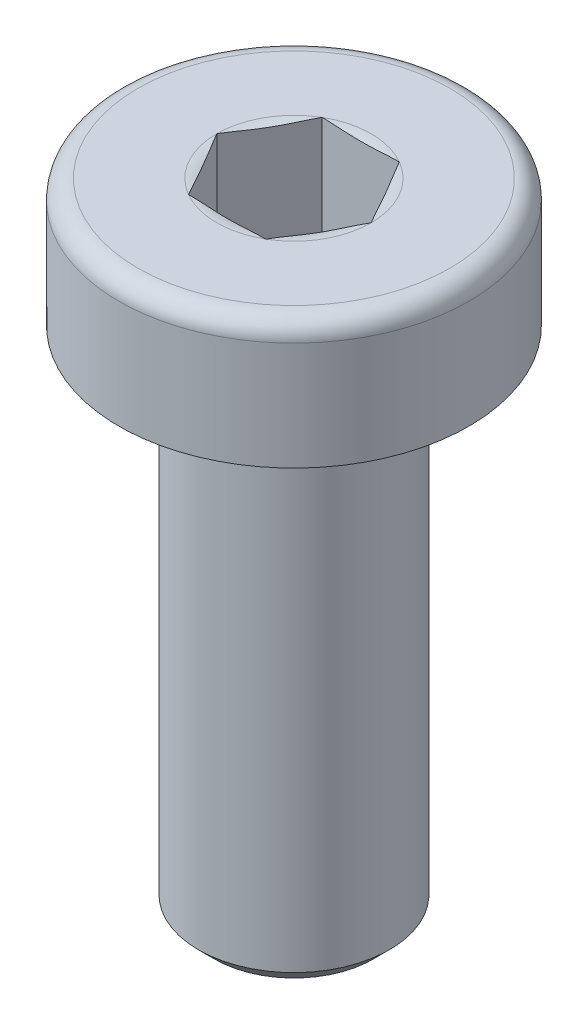
ISO-10303-21;
HEADER;
FILE_DESCRIPTION(('STEP AP214'),'2;1');
FILE_NAME('part.step','',(''),(''),'','','');
FILE_SCHEMA(('AUTOMOTIVE_DESIGN { 1 0 10303 214 1 1 1 1 }'));
ENDSEC;
DATA;
#1=APPLICATION_CONTEXT('core data for automotive mechanical design processes');
#2=APPLICATION_PROTOCOL_DEFINITION('international standard','automotive_design',2000,#1);
#3=PRODUCT_CONTEXT('',#1,'mechanical');
#4=PRODUCT('Part','Part','',(#3));
#5=PRODUCT_RELATED_PRODUCT_CATEGORY('part','',(#4));
#6=PRODUCT_DEFINITION_FORMATION('','',#4);
#7=PRODUCT_DEFINITION_CONTEXT('part definition',#1,'design');
#8=PRODUCT_DEFINITION('design','',#6,#7);
#9=PRODUCT_DEFINITION_SHAPE('','',#8);
#10=(LENGTH_UNIT() NAMED_UNIT(*) SI_UNIT(.MILLI.,.METRE.));
#11=(NAMED_UNIT(*) PLANE_ANGLE_UNIT() SI_UNIT($,.RADIAN.));
#12=(NAMED_UNIT(*) SI_UNIT($,.STERADIAN.) SOLID_ANGLE_UNIT());
#13=UNCERTAINTY_MEASURE_WITH_UNIT(LENGTH_MEASURE(1.E-05),#10,'distance_accuracy_value','');
#14=(GEOMETRIC_REPRESENTATION_CONTEXT(3) GLOBAL_UNCERTAINTY_ASSIGNED_CONTEXT((#13)) GLOBAL_UNIT_ASSIGNED_CONTEXT((#10,
#11,#12)) REPRESENTATION_CONTEXT('',''));
#15=CARTESIAN_POINT('',(0.,0.,0.));
#16=DIRECTION('',(0.,0.,1.));
#17=DIRECTION('',(1.,0.,0.));
#18=AXIS2_PLACEMENT_3D('',#15,#16,#17);
#19=CARTESIAN_POINT('',(0.,0.,0.));
#20=DIRECTION('',(0.,1.,0.));
#21=DIRECTION('',(0.,0.,1.));
#22=AXIS2_PLACEMENT_3D('',#19,#20,#21);
#23=CONICAL_SURFACE('',#22,1.25,0.785398163397445);
#24=CARTESIAN_POINT('',(0.,0.,0.));
#25=DIRECTION('',(0.,-1.,0.));
#26=DIRECTION('',(0.,0.,1.));
#27=AXIS2_PLACEMENT_3D('',#24,#25,#26);
#28=CIRCLE('',#27,1.25);
#29=CARTESIAN_POINT('',(0.,0.,1.25));
#30=VERTEX_POINT('',#29);
#31=EDGE_CURVE('E117',#30,#30,#28,.T.);
#32=ORIENTED_EDGE('',*,*,#31,.F.);
#33=EDGE_LOOP('',(#32));
#34=FACE_BOUND('',#33,.T.);
#35=CARTESIAN_POINT('',(0.,0.25,0.));
#36=DIRECTION('',(0.,1.,0.));
#37=DIRECTION('',(0.,0.,1.));
#38=AXIS2_PLACEMENT_3D('',#35,#36,#37);
#39=CIRCLE('',#38,1.5);
#40=CARTESIAN_POINT('',(0.,0.25,1.5));
#41=VERTEX_POINT('',#40);
#42=EDGE_CURVE('E127',#41,#41,#39,.T.);
#43=ORIENTED_EDGE('',*,*,#42,.F.);
#44=EDGE_LOOP('',(#43));
#45=FACE_BOUND('',#44,.T.);
#46=ADVANCED_FACE('F17',(#34,#45),#23,.T.);
#47=CARTESIAN_POINT('',(0.,9.7,0.));
#48=DIRECTION('',(0.,-1.,0.));
#49=DIRECTION('',(0.,0.,-1.));
#50=AXIS2_PLACEMENT_3D('',#47,#48,#49);
#51=TOROIDAL_SURFACE('',#50,2.45,0.3);
#52=CARTESIAN_POINT('',(0.,10.,0.));
#53=DIRECTION('',(0.,1.,0.));
#54=DIRECTION('',(0.,0.,-1.));
#55=AXIS2_PLACEMENT_3D('',#52,#53,#54);
#56=CIRCLE('',#55,2.45);
#57=CARTESIAN_POINT('',(0.,10.,-2.45));
#58=VERTEX_POINT('',#57);
#59=EDGE_CURVE('E138',#58,#58,#56,.T.);
#60=ORIENTED_EDGE('',*,*,#59,.F.);
#61=EDGE_LOOP('',(#60));
#62=FACE_BOUND('',#61,.T.);
#63=CARTESIAN_POINT('',(0.,9.7,0.));
#64=DIRECTION('',(0.,-1.,0.));
#65=DIRECTION('',(0.,0.,-1.));
#66=AXIS2_PLACEMENT_3D('',#63,#64,#65);
#67=CIRCLE('',#66,2.75);
#68=CARTESIAN_POINT('',(0.,9.7,-2.75));
#69=VERTEX_POINT('',#68);
#70=EDGE_CURVE('E135',#69,#69,#67,.T.);
#71=ORIENTED_EDGE('',*,*,#70,.F.);
#72=EDGE_LOOP('',(#71));
#73=FACE_BOUND('',#72,.T.);
#74=ADVANCED_FACE('F577',(#62,#73),#51,.T.);
#75=CARTESIAN_POINT('',(-0.606217782649107,8.38,-1.05));
#76=DIRECTION('',(-0.866025403784439,0.,-0.5));
#77=DIRECTION('',(-0.5,0.,0.866025403784439));
#78=AXIS2_PLACEMENT_3D('',#75,#76,#77);
#79=PLANE('',#78);
#80=CARTESIAN_POINT('',(-1.21243556529821,10.,0.));
#81=CARTESIAN_POINT('',(-1.18581719643637,10.0000135515311,-0.0459366025688083));
#82=CARTESIAN_POINT('',(-1.15906508915522,9.99824357585699,-0.0917088003624228));
#83=CARTESIAN_POINT('',(-1.10698991980712,9.9933565243743,-0.180917901343503));
#84=CARTESIAN_POINT('',(-1.08166295056354,9.99031203298913,-0.224355943379598));
#85=CARTESIAN_POINT('',(-1.03198438038876,9.98475410897419,-0.310421239080379));
#86=CARTESIAN_POINT('',(-1.00762399362389,9.98222962991004,-0.353042749356666));
#87=CARTESIAN_POINT('',(-0.958710576398827,9.97876090145716,-0.438829126021009));
#88=CARTESIAN_POINT('',(-0.934158121505698,9.97783306559845,-0.481995093779069));
#89=CARTESIAN_POINT('',(-0.884499053108941,9.97783185652816,-0.567998278918545));
#90=CARTESIAN_POINT('',(-0.859392525370443,9.97875819827151,-0.610835545815294));
#91=CARTESIAN_POINT('',(-0.809558602299346,9.98222544553393,-0.6960778129501));
#92=CARTESIAN_POINT('',(-0.784829930231652,9.98475006085494,-0.738482838588168));
#93=CARTESIAN_POINT('',(-0.735137773430614,9.99030886060707,-0.824538929078182));
#94=CARTESIAN_POINT('',(-0.710183728251515,9.99335415042211,-0.868194768361504));
#95=CARTESIAN_POINT('',(-0.658962013031399,9.99824298033779,-0.957909242343724));
#96=CARTESIAN_POINT('',(-0.632695279755171,10.0000137464384,-1.00397182216716));
#97=CARTESIAN_POINT('',(-0.606217782649105,10.,-1.05));
#98=B_SPLINE_CURVE_WITH_KNOTS('',3,(#80,#81,#82,#83,#84,#85,#86,#87,#88,#89,#90,#91,#92,#93,#94,
#95,#96,#97),.UNSPECIFIED.,.F.,.F.,(4,2,2,2,2,2,2,2,4),(0.,0.159151799274514,0.31026205356059,
0.457724183008924,0.606693366830151,0.755639651188643,0.903091736858328,1.05420862044747,
1.21338690484107),.UNSPECIFIED.);
#99=CARTESIAN_POINT('',(-1.21243556529821,10.,0.));
#100=VERTEX_POINT('',#99);
#101=CARTESIAN_POINT('',(-0.606217782649107,10.,-1.05));
#102=VERTEX_POINT('',#101);
#103=EDGE_CURVE('E153',#100,#102,#98,.T.);
#104=ORIENTED_EDGE('',*,*,#103,.F.);
#105=DIRECTION('',(0.,1.,0.));
#106=VECTOR('',#105,1.);
#107=CARTESIAN_POINT('',(-1.21243556529821,8.38,0.));
#108=LINE('',#107,#106);
#109=CARTESIAN_POINT('',(-1.21243556529821,8.38,0.));
#110=VERTEX_POINT('',#109);
#111=EDGE_CURVE('E219',#110,#100,#108,.T.);
#112=ORIENTED_EDGE('',*,*,#111,.F.);
#113=DIRECTION('',(-0.5,0.,0.866025403784439));
#114=VECTOR('',#113,1.);
#115=CARTESIAN_POINT('',(-0.606217782649107,8.38,-1.05));
#116=LINE('',#115,#114);
#117=CARTESIAN_POINT('',(-0.606217782649107,8.38,-1.05));
#118=VERTEX_POINT('',#117);
#119=EDGE_CURVE('E148',#118,#110,#116,.T.);
#120=ORIENTED_EDGE('',*,*,#119,.F.);
#121=DIRECTION('',(0.,1.,0.));
#122=VECTOR('',#121,1.);
#123=CARTESIAN_POINT('',(-0.606217782649107,8.38,-1.05));
#124=LINE('',#123,#122);
#125=EDGE_CURVE('E11',#118,#102,#124,.T.);
#126=ORIENTED_EDGE('',*,*,#125,.T.);
#127=EDGE_LOOP('',(#104,#112,#120,#126));
#128=FACE_BOUND('',#127,.T.);
#129=ADVANCED_FACE('F566',(#128),#79,.F.);
#130=CARTESIAN_POINT('',(0.606217782649108,8.38,-1.05));
#131=DIRECTION('',(0.,0.,-1.));
#132=DIRECTION('',(0.,-1.,0.));
#133=AXIS2_PLACEMENT_3D('',#130,#131,#132);
#134=PLANE('',#133);
#135=CARTESIAN_POINT('',(-0.606217782649105,10.,-1.05));
#136=CARTESIAN_POINT('',(-0.553179311774835,10.0000134932338,-1.04991640295144));
#137=CARTESIAN_POINT('',(-0.500216121951248,9.99824712231727,-1.04963564142699));
#138=CARTESIAN_POINT('',(-0.397019942147565,9.99336792194971,-1.04914374164374));
#139=CARTESIAN_POINT('',(-0.346784019863165,9.9903275195735,-1.04892980541921));
#140=CARTESIAN_POINT('',(-0.247500638305908,9.98477346899734,-1.04893942853077));
#141=CARTESIAN_POINT('',(-0.198453753472331,9.98224887994885,-1.04915255502913));
#142=CARTESIAN_POINT('',(-0.0997974197531861,9.9787744057667,-1.04968359843514));
#143=CARTESIAN_POINT('',(-0.0501873106370085,9.97784075217595,-1.05000255628005));
#144=CARTESIAN_POINT('',(0.0491231766687881,9.97782424310257,-1.04999743908656));
#145=CARTESIAN_POINT('',(0.0988235554898503,9.97874474534756,-1.04967219747236));
#146=CARTESIAN_POINT('',(0.197656047274623,9.98220621321126,-1.04913399544364));
#147=CARTESIAN_POINT('',(0.246788826411641,9.98473070555914,-1.04891993334845));
#148=CARTESIAN_POINT('',(0.346252287417021,9.99029336467848,-1.04891319011046));
#149=CARTESIAN_POINT('',(0.396582377667405,9.99334274322376,-1.04913111903373));
#150=CARTESIAN_POINT('',(0.499986996347023,9.99823942924201,-1.04963102909344));
#151=CARTESIAN_POINT('',(0.553064480533542,10.0000138053791,-1.0499158103883));
#152=CARTESIAN_POINT('',(0.606217782649107,10.,-1.05));
#153=B_SPLINE_CURVE_WITH_KNOTS('',3,(#135,#136,#137,#138,#139,#140,#141,#142,#143,#144,#145,
#146,#147,#148,#149,#150,#151,#152),.UNSPECIFIED.,.F.,.F.,(4,2,2,2,2,2,2,2,4),(0.,
0.158993197313325,0.309964930242216,0.457293490584289,0.606116367386335,0.755208992784453,
0.902794628329187,1.05405000834069,1.21338690585219),.UNSPECIFIED.);
#154=CARTESIAN_POINT('',(0.606217782649108,10.,-1.05));
#155=VERTEX_POINT('',#154);
#156=EDGE_CURVE('E362',#102,#155,#153,.T.);
#157=ORIENTED_EDGE('',*,*,#156,.F.);
#158=ORIENTED_EDGE('',*,*,#125,.F.);
#159=DIRECTION('',(-1.,0.,0.));
#160=VECTOR('',#159,1.);
#161=CARTESIAN_POINT('',(0.606217782649108,8.38,-1.05));
#162=LINE('',#161,#160);
#163=CARTESIAN_POINT('',(0.606217782649108,8.38,-1.05));
#164=VERTEX_POINT('',#163);
#165=EDGE_CURVE('E142',#164,#118,#162,.T.);
#166=ORIENTED_EDGE('',*,*,#165,.F.);
#167=DIRECTION('',(0.,1.,0.));
#168=VECTOR('',#167,1.);
#169=CARTESIAN_POINT('',(0.606217782649108,8.38,-1.05));
#170=LINE('',#169,#168);
#171=EDGE_CURVE('E28',#164,#155,#170,.T.);
#172=ORIENTED_EDGE('',*,*,#171,.T.);
#173=EDGE_LOOP('',(#157,#158,#166,#172));
#174=FACE_BOUND('',#173,.T.);
#175=ADVANCED_FACE('F288',(#174),#134,.F.);
#176=CARTESIAN_POINT('',(1.21243556529821,8.38,0.));
#177=DIRECTION('',(0.866025403784439,0.,-0.5));
#178=DIRECTION('',(0.,-1.,0.));
#179=AXIS2_PLACEMENT_3D('',#176,#177,#178);
#180=PLANE('',#179);
#181=CARTESIAN_POINT('',(0.606217782649107,10.,-1.05));
#182=CARTESIAN_POINT('',(0.632690863006524,10.0000135515311,-1.00397951507359));
#183=CARTESIAN_POINT('',(0.658954695442395,9.99824357585696,-0.957925411666158));
#184=CARTESIAN_POINT('',(0.710174458466819,9.99335652437419,-0.868222441613267));
#185=CARTESIAN_POINT('',(0.7351294217389,9.99031203298899,-0.824569621829274));
#186=CARTESIAN_POINT('',(0.784824869112458,9.98475410897401,-0.738514070183813));
#187=CARTESIAN_POINT('',(0.809555986376839,9.98222962990986,-0.696106601261391));
#188=CARTESIAN_POINT('',(0.859392459254132,9.97876090145704,-0.610853151026909));
#189=CARTESIAN_POINT('',(0.884499056464985,9.97783306559839,-0.568007117485553));
#190=CARTESIAN_POINT('',(0.934150465404114,9.97783185652821,-0.481999510156155));
#191=CARTESIAN_POINT('',(0.958695362896483,9.97875819827163,-0.438837985885222));
#192=CARTESIAN_POINT('',(1.00760037017623,9.98222544553412,-0.353059408967658));
#193=CARTESIAN_POINT('',(1.03195986359313,9.98475006085512,-0.310441237935996));
#194=CARTESIAN_POINT('',(1.08164054570724,9.99030886060722,-0.224378522532333));
#195=CARTESIAN_POINT('',(1.10697058896044,9.99335415042222,-0.180939765838421));
#196=CARTESIAN_POINT('',(1.15905474490573,9.99824298033782,-0.0917232222416134));
#197=CARTESIAN_POINT('',(1.1858127425583,10.0000137464384,-0.0459442740385576));
#198=CARTESIAN_POINT('',(1.21243556529821,10.,0.));
#199=B_SPLINE_CURVE_WITH_KNOTS('',3,(#181,#182,#183,#184,#185,#186,#187,#188,#189,#190,#191,
#192,#193,#194,#195,#196,#197,#198),.UNSPECIFIED.,.F.,.F.,(4,2,2,2,2,2,2,2,4),(0.,
0.159151799275709,0.310262053562082,0.457724183009963,0.606693366830158,0.755639651189681,
0.903091736859818,1.05420862044866,1.21338690484107),.UNSPECIFIED.);
#200=CARTESIAN_POINT('',(1.21243556529821,10.,0.));
#201=VERTEX_POINT('',#200);
#202=EDGE_CURVE('E324',#155,#201,#199,.T.);
#203=ORIENTED_EDGE('',*,*,#202,.F.);
#204=ORIENTED_EDGE('',*,*,#171,.F.);
#205=DIRECTION('',(-0.5,0.,-0.866025403784439));
#206=VECTOR('',#205,1.);
#207=CARTESIAN_POINT('',(1.21243556529821,8.38,0.));
#208=LINE('',#207,#206);
#209=CARTESIAN_POINT('',(1.21243556529821,8.38,0.));
#210=VERTEX_POINT('',#209);
#211=EDGE_CURVE('E147',#210,#164,#208,.T.);
#212=ORIENTED_EDGE('',*,*,#211,.F.);
#213=DIRECTION('',(0.,1.,0.));
#214=VECTOR('',#213,1.);
#215=CARTESIAN_POINT('',(1.21243556529821,8.38,0.));
#216=LINE('',#215,#214);
#217=EDGE_CURVE('E52',#210,#201,#216,.T.);
#218=ORIENTED_EDGE('',*,*,#217,.T.);
#219=EDGE_LOOP('',(#203,#204,#212,#218));
#220=FACE_BOUND('',#219,.T.);
#221=ADVANCED_FACE('F284',(#220),#180,.F.);
#222=CARTESIAN_POINT('',(0.606217782649107,8.38,1.05));
#223=DIRECTION('',(0.866025403784439,0.,0.5));
#224=DIRECTION('',(0.,-1.,0.));
#225=AXIS2_PLACEMENT_3D('',#222,#223,#224);
#226=PLANE('',#225);
#227=CARTESIAN_POINT('',(1.21243556529821,10.,0.));
#228=CARTESIAN_POINT('',(1.18581719643625,10.0000135515311,0.0459366025690177));
#229=CARTESIAN_POINT('',(1.15906508915494,9.99824357585697,0.0917088003628147));
#230=CARTESIAN_POINT('',(1.1069899198066,9.99335652437423,0.180917901344095));
#231=CARTESIAN_POINT('',(1.08166295056293,9.99031203298905,0.224355943380209));
#232=CARTESIAN_POINT('',(1.0319843803881,9.98475410897408,0.310421239080919));
#233=CARTESIAN_POINT('',(1.00762399362325,9.98222962990993,0.353042749357115));
#234=CARTESIAN_POINT('',(0.958710576398414,9.97876090145709,0.438829126021245));
#235=CARTESIAN_POINT('',(0.93415812150549,9.97783306559841,0.481995093779184));
#236=CARTESIAN_POINT('',(0.884499053108941,9.97783185652819,0.567998278918779));
#237=CARTESIAN_POINT('',(0.859392525370441,9.97875819827158,0.610835545815765));
#238=CARTESIAN_POINT('',(0.809558602299276,9.98222544553404,0.696077812950874));
#239=CARTESIAN_POINT('',(0.784829930231515,9.98475006085505,0.738482838589009));
#240=CARTESIAN_POINT('',(0.735137773430388,9.99030886060716,0.824538929079009));
#241=CARTESIAN_POINT('',(0.710183728251265,9.99335415042217,0.86819476836225));
#242=CARTESIAN_POINT('',(0.658962013031203,9.99824298033781,0.957909242344159));
#243=CARTESIAN_POINT('',(0.632695279755055,10.0000137464384,1.00397182216736));
#244=CARTESIAN_POINT('',(0.606217782649109,10.,1.05));
#245=B_SPLINE_CURVE_WITH_KNOTS('',3,(#227,#228,#229,#230,#231,#232,#233,#234,#235,#236,#237,
#238,#239,#240,#241,#242,#243,#244),.UNSPECIFIED.,.F.,.F.,(4,2,2,2,2,2,2,2,4),(0.,
0.159151799275231,0.310262053561485,0.457724183009545,0.60669336683015,0.755639651189262,
0.903091736859219,1.05420862044818,1.21338690484107),.UNSPECIFIED.);
#246=CARTESIAN_POINT('',(0.606217782649109,10.,1.05));
#247=VERTEX_POINT('',#246);
#248=EDGE_CURVE('E313',#201,#247,#245,.T.);
#249=ORIENTED_EDGE('',*,*,#248,.F.);
#250=ORIENTED_EDGE('',*,*,#217,.F.);
#251=DIRECTION('',(0.5,0.,-0.866025403784439));
#252=VECTOR('',#251,1.);
#253=CARTESIAN_POINT('',(0.606217782649107,8.38,1.05));
#254=LINE('',#253,#252);
#255=CARTESIAN_POINT('',(0.606217782649107,8.38,1.05));
#256=VERTEX_POINT('',#255);
#257=EDGE_CURVE('E161',#256,#210,#254,.T.);
#258=ORIENTED_EDGE('',*,*,#257,.F.);
#259=DIRECTION('',(0.,1.,0.));
#260=VECTOR('',#259,1.);
#261=CARTESIAN_POINT('',(0.606217782649107,8.38,1.05));
#262=LINE('',#261,#260);
#263=EDGE_CURVE('E269',#256,#247,#262,.T.);
#264=ORIENTED_EDGE('',*,*,#263,.T.);
#265=EDGE_LOOP('',(#249,#250,#258,#264));
#266=FACE_BOUND('',#265,.T.);
#267=ADVANCED_FACE('F201',(#266),#226,.F.);
#268=CARTESIAN_POINT('',(-0.606217782649108,8.38,1.05));
#269=DIRECTION('',(0.,0.,1.));
#270=DIRECTION('',(1.,0.,0.));
#271=AXIS2_PLACEMENT_3D('',#268,#269,#270);
#272=PLANE('',#271);
#273=CARTESIAN_POINT('',(0.606217782649109,10.,1.05));
#274=CARTESIAN_POINT('',(0.570510848105489,10.0000091224032,1.049986725072));
#275=CARTESIAN_POINT('',(0.534825108899802,9.99921029273787,1.04983848648945));
#276=CARTESIAN_POINT('',(0.464867259032951,9.99668594406953,1.04948522099447));
#277=CARTESIAN_POINT('',(0.430593911077885,9.99499750189674,1.04928261501804));
#278=CARTESIAN_POINT('',(0.363061499215714,9.99133997606677,1.0490056878249));
#279=CARTESIAN_POINT('',(0.32980182400891,9.98938044284154,1.04892781925119));
#280=CARTESIAN_POINT('',(0.263814235911331,9.98568319133919,1.04894142011013));
#281=CARTESIAN_POINT('',(0.231086520846329,9.98394236990852,1.04903014135832));
#282=CARTESIAN_POINT('',(0.165650128351185,9.98102495807305,1.04931632410359));
#283=CARTESIAN_POINT('',(0.132941486327995,9.97984759744932,1.04951363636459));
#284=CARTESIAN_POINT('',(0.0670139991698219,9.97824799241079,1.04985532561956));
#285=CARTESIAN_POINT('',(0.0337948414885051,9.9778373077695,1.04999886656251));
#286=CARTESIAN_POINT('',(0.000384684980260173,9.97783247730434,1.05000000656299));
#287=CARTESIAN_POINT('',(0.000192342513647955,9.97783246310375,1.05000000835133));
#288=CARTESIAN_POINT('',(-0.0330861076048037,9.97783235111928,1.04999945904338));
#289=CARTESIAN_POINT('',(-0.0661736069836569,9.97823327921561,1.04985205238798));
#290=CARTESIAN_POINT('',(-0.132030438937387,9.97981466468064,1.04950573412756));
#291=CARTESIAN_POINT('',(-0.164799959469746,9.98098808672206,1.04930729711825));
#292=CARTESIAN_POINT('',(-0.230356591195301,9.98390239027906,1.04901927067581));
#293=CARTESIAN_POINT('',(-0.263143667901157,9.98564402376576,1.04892982623027));
#294=CARTESIAN_POINT('',(-0.329252030251775,9.989346634949,1.04891653632912));
#295=CARTESIAN_POINT('',(-0.362573113933327,9.99131078399588,1.04899547507587));
#296=CARTESIAN_POINT('',(-0.430233846299544,9.99497876903371,1.0492754845467));
#297=CARTESIAN_POINT('',(-0.464574107759461,9.99667304519687,1.04948014281383));
#298=CARTESIAN_POINT('',(-0.534674220670853,9.99920693979521,1.04983694091695));
#299=CARTESIAN_POINT('',(-0.570435320012137,10.0000092247088,1.04998662218607));
#300=CARTESIAN_POINT('',(-0.606217782649107,10.,1.05));
#301=B_SPLINE_CURVE_WITH_KNOTS('',3,(#273,#274,#275,#276,#277,#278,#279,#280,#281,#282,#283,
#284,#285,#286,#287,#288,#289,#290,#291,#292,#293,#294,#295,#296,#297,#298,#299,#300),
.UNSPECIFIED.,.F.,.F.,(4,2,2,2,2,2,2,2,2,2,2,2,2,4),(0.,0.10708280515783,0.210019604256197,
0.309973452712793,0.408292861534375,0.506477486691195,0.606130921519596,0.60670794901312,
0.705966263670434,0.804332882446435,0.902830211291252,1.00296879624457,1.10610695707966,
1.21341606202591),.UNSPECIFIED.);
#302=CARTESIAN_POINT('',(-0.606217782649108,10.,1.05));
#303=VERTEX_POINT('',#302);
#304=EDGE_CURVE('E260',#247,#303,#301,.T.);
#305=ORIENTED_EDGE('',*,*,#304,.F.);
#306=ORIENTED_EDGE('',*,*,#263,.F.);
#307=DIRECTION('',(1.,0.,0.));
#308=VECTOR('',#307,1.);
#309=CARTESIAN_POINT('',(-0.606217782649108,8.38,1.05));
#310=LINE('',#309,#308);
#311=CARTESIAN_POINT('',(-0.606217782649108,8.38,1.05));
#312=VERTEX_POINT('',#311);
#313=EDGE_CURVE('E157',#312,#256,#310,.T.);
#314=ORIENTED_EDGE('',*,*,#313,.F.);
#315=DIRECTION('',(0.,1.,0.));
#316=VECTOR('',#315,1.);
#317=CARTESIAN_POINT('',(-0.606217782649108,8.38,1.05));
#318=LINE('',#317,#316);
#319=EDGE_CURVE('E146',#312,#303,#318,.T.);
#320=ORIENTED_EDGE('',*,*,#319,.T.);
#321=EDGE_LOOP('',(#305,#306,#314,#320));
#322=FACE_BOUND('',#321,.T.);
#323=ADVANCED_FACE('F198',(#322),#272,.F.);
#324=CARTESIAN_POINT('',(-1.21243556529821,8.38,0.));
#325=DIRECTION('',(-0.866025403784439,0.,0.5));
#326=DIRECTION('',(0.,1.,0.));
#327=AXIS2_PLACEMENT_3D('',#324,#325,#326);
#328=PLANE('',#327);
#329=CARTESIAN_POINT('',(-0.606217782649105,10.,1.05));
#330=CARTESIAN_POINT('',(-0.632690863006483,10.0000135515311,1.00397951507366));
#331=CARTESIAN_POINT('',(-0.658954695442328,9.99824357585697,0.957925411666304));
#332=CARTESIAN_POINT('',(-0.710174458466736,9.99335652437421,0.868222441613516));
#333=CARTESIAN_POINT('',(-0.735129421738826,9.99031203298902,0.82456962182955));
#334=CARTESIAN_POINT('',(-0.784824869112412,9.98475410897404,0.738514070184093));
#335=CARTESIAN_POINT('',(-0.809555986376814,9.98222962990989,0.696106601261649));
#336=CARTESIAN_POINT('',(-0.859392459254129,9.97876090145706,0.610853151027067));
#337=CARTESIAN_POINT('',(-0.884499056464982,9.9778330655984,0.568007117485633));
#338=CARTESIAN_POINT('',(-0.934150465404041,9.9778318565282,0.481999510156195));
#339=CARTESIAN_POINT('',(-0.958695362896344,9.97875819827161,0.438837985885301));
#340=CARTESIAN_POINT('',(-1.00760037017602,9.98222544553408,0.353059408967808));
#341=CARTESIAN_POINT('',(-1.0319598635929,9.98475006085509,0.310441237936175));
#342=CARTESIAN_POINT('',(-1.08164054570703,9.99030886060719,0.224378522532535));
#343=CARTESIAN_POINT('',(-1.10697058896026,9.99335415042219,0.180939765838617));
#344=CARTESIAN_POINT('',(-1.15905474490564,9.99824298033781,0.0917232222417433));
#345=CARTESIAN_POINT('',(-1.18581274255826,10.0000137464384,0.0459442740386276));
#346=CARTESIAN_POINT('',(-1.21243556529821,10.,0.));
#347=B_SPLINE_CURVE_WITH_KNOTS('',3,(#329,#330,#331,#332,#333,#334,#335,#336,#337,#338,#339,
#340,#341,#342,#343,#344,#345,#346),.UNSPECIFIED.,.F.,.F.,(4,2,2,2,2,2,2,2,4),(0.,
0.159151799275472,0.310262053561787,0.457724183009757,0.606693366830155,0.755639651189474,
0.903091736859522,1.05420862044842,1.21338690484107),.UNSPECIFIED.);
#348=EDGE_CURVE('E227',#303,#100,#347,.T.);
#349=ORIENTED_EDGE('',*,*,#348,.F.);
#350=ORIENTED_EDGE('',*,*,#319,.F.);
#351=DIRECTION('',(0.5,0.,0.866025403784439));
#352=VECTOR('',#351,1.);
#353=CARTESIAN_POINT('',(-1.21243556529821,8.38,0.));
#354=LINE('',#353,#352);
#355=EDGE_CURVE('E152',#110,#312,#354,.T.);
#356=ORIENTED_EDGE('',*,*,#355,.F.);
#357=ORIENTED_EDGE('',*,*,#111,.T.);
#358=EDGE_LOOP('',(#349,#350,#356,#357));
#359=FACE_BOUND('',#358,.T.);
#360=ADVANCED_FACE('F196',(#359),#328,.F.);
#361=CARTESIAN_POINT('',(0.,8.38,0.));
#362=DIRECTION('',(0.,1.,0.));
#363=DIRECTION('',(1.,0.,0.));
#364=AXIS2_PLACEMENT_3D('',#361,#362,#363);
#365=PLANE('',#364);
#366=ORIENTED_EDGE('',*,*,#119,.T.);
#367=ORIENTED_EDGE('',*,*,#355,.T.);
#368=ORIENTED_EDGE('',*,*,#313,.T.);
#369=ORIENTED_EDGE('',*,*,#257,.T.);
#370=ORIENTED_EDGE('',*,*,#211,.T.);
#371=ORIENTED_EDGE('',*,*,#165,.T.);
#372=EDGE_LOOP('',(#366,#367,#368,#369,#370,#371));
#373=FACE_BOUND('',#372,.T.);
#374=ADVANCED_FACE('F190',(#373),#365,.T.);
#375=CARTESIAN_POINT('',(0.,9.39378221735089,0.));
#376=DIRECTION('',(0.,1.,0.));
#377=DIRECTION('',(0.,0.,1.));
#378=AXIS2_PLACEMENT_3D('',#375,#376,#377);
#379=TOROIDAL_SURFACE('',#378,1.21243556529821,0.606217782649107);
#380=ORIENTED_EDGE('',*,*,#103,.T.);
#381=CARTESIAN_POINT('',(0.,10.,0.));
#382=DIRECTION('',(0.,1.,0.));
#383=DIRECTION('',(0.,0.,1.));
#384=AXIS2_PLACEMENT_3D('',#381,#382,#383);
#385=CIRCLE('',#384,1.21243556529821);
#386=EDGE_CURVE('E346',#102,#100,#385,.T.);
#387=ORIENTED_EDGE('',*,*,#386,.T.);
#388=EDGE_LOOP('',(#380,#387));
#389=FACE_BOUND('',#388,.T.);
#390=ADVANCED_FACE('F179',(#389),#379,.T.);
#391=CARTESIAN_POINT('',(0.,9.39378221735089,0.));
#392=DIRECTION('',(0.,1.,0.));
#393=DIRECTION('',(0.,0.,1.));
#394=AXIS2_PLACEMENT_3D('',#391,#392,#393);
#395=TOROIDAL_SURFACE('',#394,1.21243556529821,0.606217782649107);
#396=ORIENTED_EDGE('',*,*,#156,.T.);
#397=CARTESIAN_POINT('',(0.,10.,0.));
#398=DIRECTION('',(0.,1.,0.));
#399=DIRECTION('',(0.,0.,1.));
#400=AXIS2_PLACEMENT_3D('',#397,#398,#399);
#401=CIRCLE('',#400,1.21243556529821);
#402=EDGE_CURVE('E336',#155,#102,#401,.T.);
#403=ORIENTED_EDGE('',*,*,#402,.T.);
#404=EDGE_LOOP('',(#396,#403));
#405=FACE_BOUND('',#404,.T.);
#406=ADVANCED_FACE('F189',(#405),#395,.T.);
#407=CARTESIAN_POINT('',(0.,9.39378221735089,0.));
#408=DIRECTION('',(0.,1.,0.));
#409=DIRECTION('',(0.,0.,1.));
#410=AXIS2_PLACEMENT_3D('',#407,#408,#409);
#411=TOROIDAL_SURFACE('',#410,1.21243556529821,0.606217782649107);
#412=ORIENTED_EDGE('',*,*,#202,.T.);
#413=CARTESIAN_POINT('',(0.,10.,0.));
#414=DIRECTION('',(0.,1.,0.));
#415=DIRECTION('',(0.,0.,1.));
#416=AXIS2_PLACEMENT_3D('',#413,#414,#415);
#417=CIRCLE('',#416,1.21243556529821);
#418=EDGE_CURVE('E333',#201,#155,#417,.T.);
#419=ORIENTED_EDGE('',*,*,#418,.T.);
#420=EDGE_LOOP('',(#412,#419));
#421=FACE_BOUND('',#420,.T.);
#422=ADVANCED_FACE('F191',(#421),#411,.T.);
#423=CARTESIAN_POINT('',(0.,9.39378221735089,0.));
#424=DIRECTION('',(0.,1.,0.));
#425=DIRECTION('',(0.,0.,1.));
#426=AXIS2_PLACEMENT_3D('',#423,#424,#425);
#427=TOROIDAL_SURFACE('',#426,1.21243556529821,0.606217782649107);
#428=ORIENTED_EDGE('',*,*,#248,.T.);
#429=CARTESIAN_POINT('',(0.,10.,0.));
#430=DIRECTION('',(0.,1.,0.));
#431=DIRECTION('',(0.,0.,1.));
#432=AXIS2_PLACEMENT_3D('',#429,#430,#431);
#433=CIRCLE('',#432,1.21243556529821);
#434=EDGE_CURVE('E141',#247,#201,#433,.T.);
#435=ORIENTED_EDGE('',*,*,#434,.T.);
#436=EDGE_LOOP('',(#428,#435));
#437=FACE_BOUND('',#436,.T.);
#438=ADVANCED_FACE('F246',(#437),#427,.T.);
#439=CARTESIAN_POINT('',(0.,9.39378221735089,0.));
#440=DIRECTION('',(0.,1.,0.));
#441=DIRECTION('',(0.,0.,1.));
#442=AXIS2_PLACEMENT_3D('',#439,#440,#441);
#443=TOROIDAL_SURFACE('',#442,1.21243556529821,0.606217782649107);
#444=ORIENTED_EDGE('',*,*,#304,.T.);
#445=CARTESIAN_POINT('',(0.,10.,0.));
#446=DIRECTION('',(0.,1.,0.));
#447=DIRECTION('',(0.,0.,1.));
#448=AXIS2_PLACEMENT_3D('',#445,#446,#447);
#449=CIRCLE('',#448,1.21243556529821);
#450=EDGE_CURVE('E263',#303,#247,#449,.T.);
#451=ORIENTED_EDGE('',*,*,#450,.T.);
#452=EDGE_LOOP('',(#444,#451));
#453=FACE_BOUND('',#452,.T.);
#454=ADVANCED_FACE('F242',(#453),#443,.T.);
#455=CARTESIAN_POINT('',(0.,9.39378221735089,0.));
#456=DIRECTION('',(0.,1.,0.));
#457=DIRECTION('',(0.,0.,1.));
#458=AXIS2_PLACEMENT_3D('',#455,#456,#457);
#459=TOROIDAL_SURFACE('',#458,1.21243556529821,0.606217782649107);
#460=ORIENTED_EDGE('',*,*,#348,.T.);
#461=CARTESIAN_POINT('',(0.,10.,0.));
#462=DIRECTION('',(0.,1.,0.));
#463=DIRECTION('',(0.,0.,1.));
#464=AXIS2_PLACEMENT_3D('',#461,#462,#463);
#465=CIRCLE('',#464,1.21243556529821);
#466=EDGE_CURVE('E266',#100,#303,#465,.T.);
#467=ORIENTED_EDGE('',*,*,#466,.T.);
#468=EDGE_LOOP('',(#460,#467));
#469=FACE_BOUND('',#468,.T.);
#470=ADVANCED_FACE('F231',(#469),#459,.T.);
#471=CARTESIAN_POINT('',(-2.75,10.,0.));
#472=DIRECTION('',(0.,-1.,0.));
#473=DIRECTION('',(0.,0.,-1.));
#474=AXIS2_PLACEMENT_3D('',#471,#472,#473);
#475=PLANE('',#474);
#476=ORIENTED_EDGE('',*,*,#434,.F.);
#477=ORIENTED_EDGE('',*,*,#450,.F.);
#478=ORIENTED_EDGE('',*,*,#466,.F.);
#479=ORIENTED_EDGE('',*,*,#386,.F.);
#480=ORIENTED_EDGE('',*,*,#402,.F.);
#481=ORIENTED_EDGE('',*,*,#418,.F.);
#482=EDGE_LOOP('',(#476,#477,#478,#479,#480,#481));
#483=FACE_BOUND('',#482,.T.);
#484=ORIENTED_EDGE('',*,*,#59,.T.);
#485=EDGE_LOOP('',(#484));
#486=FACE_BOUND('',#485,.T.);
#487=ADVANCED_FACE('F241',(#483,#486),#475,.F.);
#488=CARTESIAN_POINT('',(0.,0.,0.));
#489=DIRECTION('',(0.,-1.,0.));
#490=DIRECTION('',(0.,0.,-1.));
#491=AXIS2_PLACEMENT_3D('',#488,#489,#490);
#492=CYLINDRICAL_SURFACE('',#491,2.75);
#493=ORIENTED_EDGE('',*,*,#70,.T.);
#494=EDGE_LOOP('',(#493));
#495=FACE_BOUND('',#494,.T.);
#496=CARTESIAN_POINT('',(0.,8.,0.));
#497=DIRECTION('',(0.,-1.,0.));
#498=DIRECTION('',(0.,0.,-1.));
#499=AXIS2_PLACEMENT_3D('',#496,#497,#498);
#500=CIRCLE('',#499,2.75);
#501=CARTESIAN_POINT('',(0.,8.,-2.75));
#502=VERTEX_POINT('',#501);
#503=EDGE_CURVE('E132',#502,#502,#500,.T.);
#504=ORIENTED_EDGE('',*,*,#503,.F.);
#505=EDGE_LOOP('',(#504));
#506=FACE_BOUND('',#505,.T.);
#507=ADVANCED_FACE('F450',(#495,#506),#492,.T.);
#508=CARTESIAN_POINT('',(-1.5,8.,0.));
#509=DIRECTION('',(0.,1.,0.));
#510=DIRECTION('',(1.,0.,0.));
#511=AXIS2_PLACEMENT_3D('',#508,#509,#510);
#512=PLANE('',#511);
#513=CARTESIAN_POINT('',(0.,8.,0.));
#514=DIRECTION('',(0.,-1.,0.));
#515=DIRECTION('',(0.,0.,-1.));
#516=AXIS2_PLACEMENT_3D('',#513,#514,#515);
#517=CIRCLE('',#516,1.5);
#518=CARTESIAN_POINT('',(0.,8.,-1.5));
#519=VERTEX_POINT('',#518);
#520=EDGE_CURVE('E121',#519,#519,#517,.T.);
#521=ORIENTED_EDGE('',*,*,#520,.F.);
#522=EDGE_LOOP('',(#521));
#523=FACE_BOUND('',#522,.T.);
#524=ORIENTED_EDGE('',*,*,#503,.T.);
#525=EDGE_LOOP('',(#524));
#526=FACE_BOUND('',#525,.T.);
#527=ADVANCED_FACE('F440',(#523,#526),#512,.F.);
#528=CARTESIAN_POINT('',(0.,0.,0.));
#529=DIRECTION('',(0.,-1.,0.));
#530=DIRECTION('',(0.,0.,-1.));
#531=AXIS2_PLACEMENT_3D('',#528,#529,#530);
#532=CYLINDRICAL_SURFACE('',#531,1.5);
#533=ORIENTED_EDGE('',*,*,#42,.T.);
#534=EDGE_LOOP('',(#533));
#535=FACE_BOUND('',#534,.T.);
#536=ORIENTED_EDGE('',*,*,#520,.T.);
#537=EDGE_LOOP('',(#536));
#538=FACE_BOUND('',#537,.T.);
#539=ADVANCED_FACE('F429',(#535,#538),#532,.T.);
#540=CARTESIAN_POINT('',(-1.5,0.,0.));
#541=DIRECTION('',(0.,1.,0.));
#542=DIRECTION('',(1.,0.,0.));
#543=AXIS2_PLACEMENT_3D('',#540,#541,#542);
#544=PLANE('',#543);
#545=ORIENTED_EDGE('',*,*,#31,.T.);
#546=EDGE_LOOP('',(#545));
#547=FACE_BOUND('',#546,.T.);
#548=ADVANCED_FACE('F118',(#547),#544,.F.);
#549=CLOSED_SHELL('',(#46,#74,#129,#175,#221,#267,#323,#360,#374,#390,#406,#422,#438,#454,#470,
#487,#507,#527,#539,#548));
#550=MANIFOLD_SOLID_BREP('B1',#549);
#551=ADVANCED_BREP_SHAPE_REPRESENTATION('',(#18,#550),#14);
#552=SHAPE_DEFINITION_REPRESENTATION(#9,#551);
ENDSEC;
END-ISO-10303-21;
